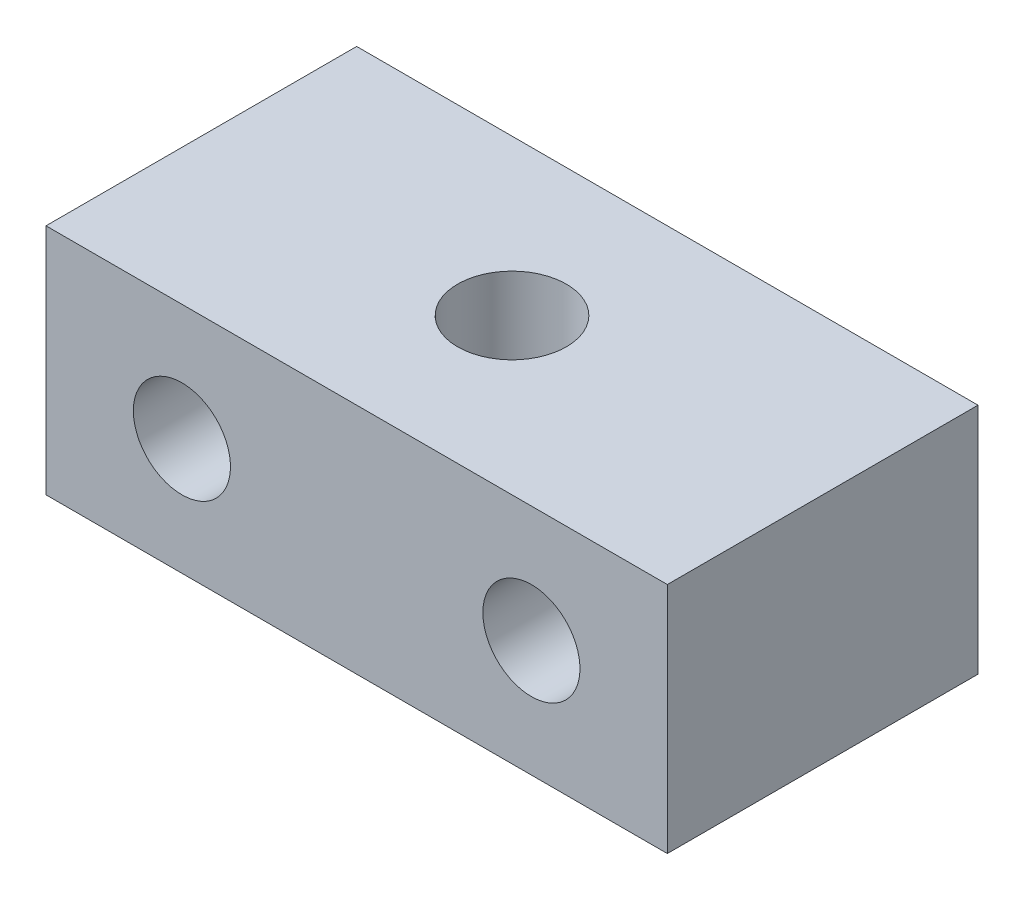
ISO-10303-21;
HEADER;
FILE_DESCRIPTION(('STEP AP214'),'2;1');
FILE_NAME('part.step','',(''),(''),'','','');
FILE_SCHEMA(('AUTOMOTIVE_DESIGN { 1 0 10303 214 1 1 1 1 }'));
ENDSEC;
DATA;
#1=APPLICATION_CONTEXT('core data for automotive mechanical design processes');
#2=APPLICATION_PROTOCOL_DEFINITION('international standard','automotive_design',2000,#1);
#3=PRODUCT_CONTEXT('',#1,'mechanical');
#4=PRODUCT('Part','Part','',(#3));
#5=PRODUCT_RELATED_PRODUCT_CATEGORY('part','',(#4));
#6=PRODUCT_DEFINITION_FORMATION('','',#4);
#7=PRODUCT_DEFINITION_CONTEXT('part definition',#1,'design');
#8=PRODUCT_DEFINITION('design','',#6,#7);
#9=PRODUCT_DEFINITION_SHAPE('','',#8);
#10=(LENGTH_UNIT() NAMED_UNIT(*) SI_UNIT(.MILLI.,.METRE.));
#11=(NAMED_UNIT(*) PLANE_ANGLE_UNIT() SI_UNIT($,.RADIAN.));
#12=(NAMED_UNIT(*) SI_UNIT($,.STERADIAN.) SOLID_ANGLE_UNIT());
#13=UNCERTAINTY_MEASURE_WITH_UNIT(LENGTH_MEASURE(1.E-05),#10,'distance_accuracy_value','');
#14=(GEOMETRIC_REPRESENTATION_CONTEXT(3) GLOBAL_UNCERTAINTY_ASSIGNED_CONTEXT((#13)) GLOBAL_UNIT_ASSIGNED_CONTEXT((#10,
#11,#12)) REPRESENTATION_CONTEXT('',''));
#15=CARTESIAN_POINT('',(0.,0.,0.));
#16=DIRECTION('',(0.,0.,1.));
#17=DIRECTION('',(1.,0.,0.));
#18=AXIS2_PLACEMENT_3D('',#15,#16,#17);
#19=CARTESIAN_POINT('',(0.,0.,12.7));
#20=DIRECTION('',(0.,0.,1.));
#21=DIRECTION('',(1.,0.,0.));
#22=AXIS2_PLACEMENT_3D('',#19,#20,#21);
#23=PLANE('',#22);
#24=CARTESIAN_POINT('',(-14.2875,0.,12.7));
#25=DIRECTION('',(0.,0.,1.));
#26=DIRECTION('',(1.,0.,0.));
#27=AXIS2_PLACEMENT_3D('',#24,#25,#26);
#28=CIRCLE('',#27,3.96875);
#29=CARTESIAN_POINT('',(-18.25625,0.,12.7));
#30=VERTEX_POINT('',#29);
#31=EDGE_CURVE('E116',#30,#30,#28,.T.);
#32=ORIENTED_EDGE('',*,*,#31,.F.);
#33=EDGE_LOOP('',(#32));
#34=FACE_BOUND('',#33,.T.);
#35=DIRECTION('',(0.,1.,0.));
#36=VECTOR('',#35,1.);
#37=CARTESIAN_POINT('',(25.4,9.525,12.7));
#38=LINE('',#37,#36);
#39=CARTESIAN_POINT('',(25.4,-9.525,12.7));
#40=VERTEX_POINT('',#39);
#41=CARTESIAN_POINT('',(25.4,9.525,12.7));
#42=VERTEX_POINT('',#41);
#43=EDGE_CURVE('E96',#40,#42,#38,.T.);
#44=ORIENTED_EDGE('',*,*,#43,.T.);
#45=DIRECTION('',(-1.,0.,0.));
#46=VECTOR('',#45,1.);
#47=CARTESIAN_POINT('',(-25.4,9.525,12.7));
#48=LINE('',#47,#46);
#49=CARTESIAN_POINT('',(-25.4,9.525,12.7));
#50=VERTEX_POINT('',#49);
#51=EDGE_CURVE('E91',#42,#50,#48,.T.);
#52=ORIENTED_EDGE('',*,*,#51,.T.);
#53=DIRECTION('',(0.,-1.,0.));
#54=VECTOR('',#53,1.);
#55=CARTESIAN_POINT('',(-25.4,9.525,12.7));
#56=LINE('',#55,#54);
#57=CARTESIAN_POINT('',(-25.4,-9.525,12.7));
#58=VERTEX_POINT('',#57);
#59=EDGE_CURVE('E94',#50,#58,#56,.T.);
#60=ORIENTED_EDGE('',*,*,#59,.T.);
#61=DIRECTION('',(1.,0.,0.));
#62=VECTOR('',#61,1.);
#63=CARTESIAN_POINT('',(-25.4,-9.525,12.7));
#64=LINE('',#63,#62);
#65=EDGE_CURVE('E61',#58,#40,#64,.T.);
#66=ORIENTED_EDGE('',*,*,#65,.T.);
#67=EDGE_LOOP('',(#44,#52,#60,#66));
#68=FACE_BOUND('',#67,.T.);
#69=CARTESIAN_POINT('',(14.2875,0.,12.7));
#70=DIRECTION('',(0.,0.,1.));
#71=DIRECTION('',(1.,0.,0.));
#72=AXIS2_PLACEMENT_3D('',#69,#70,#71);
#73=CIRCLE('',#72,3.96875);
#74=CARTESIAN_POINT('',(10.31875,0.,12.7));
#75=VERTEX_POINT('',#74);
#76=EDGE_CURVE('E138',#75,#75,#73,.T.);
#77=ORIENTED_EDGE('',*,*,#76,.F.);
#78=EDGE_LOOP('',(#77));
#79=FACE_BOUND('',#78,.T.);
#80=ADVANCED_FACE('F43',(#34,#68,#79),#23,.T.);
#81=CARTESIAN_POINT('',(0.,0.,-12.7));
#82=DIRECTION('',(0.,0.,1.));
#83=DIRECTION('',(1.,0.,0.));
#84=AXIS2_PLACEMENT_3D('',#81,#82,#83);
#85=PLANE('',#84);
#86=DIRECTION('',(0.,1.,0.));
#87=VECTOR('',#86,1.);
#88=CARTESIAN_POINT('',(25.4,9.525,-12.7));
#89=LINE('',#88,#87);
#90=CARTESIAN_POINT('',(25.4,-9.525,-12.7));
#91=VERTEX_POINT('',#90);
#92=CARTESIAN_POINT('',(25.4,9.525,-12.7));
#93=VERTEX_POINT('',#92);
#94=EDGE_CURVE('E112',#91,#93,#89,.T.);
#95=ORIENTED_EDGE('',*,*,#94,.F.);
#96=DIRECTION('',(1.,0.,0.));
#97=VECTOR('',#96,1.);
#98=CARTESIAN_POINT('',(-25.4,-9.525,-12.7));
#99=LINE('',#98,#97);
#100=CARTESIAN_POINT('',(-25.4,-9.525,-12.7));
#101=VERTEX_POINT('',#100);
#102=EDGE_CURVE('E84',#101,#91,#99,.T.);
#103=ORIENTED_EDGE('',*,*,#102,.F.);
#104=DIRECTION('',(0.,-1.,0.));
#105=VECTOR('',#104,1.);
#106=CARTESIAN_POINT('',(-25.4,9.525,-12.7));
#107=LINE('',#106,#105);
#108=CARTESIAN_POINT('',(-25.4,9.525,-12.7));
#109=VERTEX_POINT('',#108);
#110=EDGE_CURVE('E78',#109,#101,#107,.T.);
#111=ORIENTED_EDGE('',*,*,#110,.F.);
#112=DIRECTION('',(-1.,0.,0.));
#113=VECTOR('',#112,1.);
#114=CARTESIAN_POINT('',(-25.4,9.525,-12.7));
#115=LINE('',#114,#113);
#116=EDGE_CURVE('E101',#93,#109,#115,.T.);
#117=ORIENTED_EDGE('',*,*,#116,.F.);
#118=EDGE_LOOP('',(#95,#103,#111,#117));
#119=FACE_BOUND('',#118,.T.);
#120=CARTESIAN_POINT('',(-14.2875,0.,-12.7));
#121=DIRECTION('',(0.,0.,1.));
#122=DIRECTION('',(1.,0.,0.));
#123=AXIS2_PLACEMENT_3D('',#120,#121,#122);
#124=CIRCLE('',#123,3.96875);
#125=CARTESIAN_POINT('',(-18.25625,0.,-12.7));
#126=VERTEX_POINT('',#125);
#127=EDGE_CURVE('E134',#126,#126,#124,.T.);
#128=ORIENTED_EDGE('',*,*,#127,.T.);
#129=EDGE_LOOP('',(#128));
#130=FACE_BOUND('',#129,.T.);
#131=CARTESIAN_POINT('',(14.2875,0.,-12.7));
#132=DIRECTION('',(0.,0.,1.));
#133=DIRECTION('',(1.,0.,0.));
#134=AXIS2_PLACEMENT_3D('',#131,#132,#133);
#135=CIRCLE('',#134,3.96875);
#136=CARTESIAN_POINT('',(10.31875,0.,-12.7));
#137=VERTEX_POINT('',#136);
#138=EDGE_CURVE('E142',#137,#137,#135,.T.);
#139=ORIENTED_EDGE('',*,*,#138,.T.);
#140=EDGE_LOOP('',(#139));
#141=FACE_BOUND('',#140,.T.);
#142=ADVANCED_FACE('F129',(#119,#130,#141),#85,.F.);
#143=CARTESIAN_POINT('',(25.4,9.525,12.7));
#144=DIRECTION('',(-1.,0.,0.));
#145=DIRECTION('',(0.,0.,1.));
#146=AXIS2_PLACEMENT_3D('',#143,#144,#145);
#147=PLANE('',#146);
#148=ORIENTED_EDGE('',*,*,#94,.T.);
#149=DIRECTION('',(0.,0.,-1.));
#150=VECTOR('',#149,1.);
#151=CARTESIAN_POINT('',(25.4,9.525,12.7));
#152=LINE('',#151,#150);
#153=EDGE_CURVE('E11',#42,#93,#152,.T.);
#154=ORIENTED_EDGE('',*,*,#153,.F.);
#155=ORIENTED_EDGE('',*,*,#43,.F.);
#156=DIRECTION('',(0.,0.,-1.));
#157=VECTOR('',#156,1.);
#158=CARTESIAN_POINT('',(25.4,-9.525,12.7));
#159=LINE('',#158,#157);
#160=EDGE_CURVE('E108',#40,#91,#159,.T.);
#161=ORIENTED_EDGE('',*,*,#160,.T.);
#162=EDGE_LOOP('',(#148,#154,#155,#161));
#163=FACE_BOUND('',#162,.T.);
#164=ADVANCED_FACE('F45',(#163),#147,.F.);
#165=CARTESIAN_POINT('',(-25.4,9.525,12.7));
#166=DIRECTION('',(0.,-1.,0.));
#167=DIRECTION('',(0.,0.,-1.));
#168=AXIS2_PLACEMENT_3D('',#165,#166,#167);
#169=PLANE('',#168);
#170=CARTESIAN_POINT('',(0.,9.525,0.));
#171=DIRECTION('',(0.,1.,0.));
#172=DIRECTION('',(0.,0.,1.));
#173=AXIS2_PLACEMENT_3D('',#170,#171,#172);
#174=CIRCLE('',#173,4.445);
#175=CARTESIAN_POINT('',(0.,9.525,4.445));
#176=VERTEX_POINT('',#175);
#177=EDGE_CURVE('E150',#176,#176,#174,.T.);
#178=ORIENTED_EDGE('',*,*,#177,.F.);
#179=EDGE_LOOP('',(#178));
#180=FACE_BOUND('',#179,.T.);
#181=ORIENTED_EDGE('',*,*,#116,.T.);
#182=DIRECTION('',(0.,0.,-1.));
#183=VECTOR('',#182,1.);
#184=CARTESIAN_POINT('',(-25.4,9.525,12.7));
#185=LINE('',#184,#183);
#186=EDGE_CURVE('E53',#50,#109,#185,.T.);
#187=ORIENTED_EDGE('',*,*,#186,.F.);
#188=ORIENTED_EDGE('',*,*,#51,.F.);
#189=ORIENTED_EDGE('',*,*,#153,.T.);
#190=EDGE_LOOP('',(#181,#187,#188,#189));
#191=FACE_BOUND('',#190,.T.);
#192=ADVANCED_FACE('F100',(#180,#191),#169,.F.);
#193=CARTESIAN_POINT('',(-25.4,9.525,12.7));
#194=DIRECTION('',(1.,0.,0.));
#195=DIRECTION('',(0.,1.,0.));
#196=AXIS2_PLACEMENT_3D('',#193,#194,#195);
#197=PLANE('',#196);
#198=ORIENTED_EDGE('',*,*,#110,.T.);
#199=DIRECTION('',(0.,0.,-1.));
#200=VECTOR('',#199,1.);
#201=CARTESIAN_POINT('',(-25.4,-9.525,12.7));
#202=LINE('',#201,#200);
#203=EDGE_CURVE('E103',#58,#101,#202,.T.);
#204=ORIENTED_EDGE('',*,*,#203,.F.);
#205=ORIENTED_EDGE('',*,*,#59,.F.);
#206=ORIENTED_EDGE('',*,*,#186,.T.);
#207=EDGE_LOOP('',(#198,#204,#205,#206));
#208=FACE_BOUND('',#207,.T.);
#209=ADVANCED_FACE('F104',(#208),#197,.F.);
#210=CARTESIAN_POINT('',(-25.4,-9.525,12.7));
#211=DIRECTION('',(0.,1.,0.));
#212=DIRECTION('',(0.,0.,1.));
#213=AXIS2_PLACEMENT_3D('',#210,#211,#212);
#214=PLANE('',#213);
#215=CARTESIAN_POINT('',(0.,-9.525,0.));
#216=DIRECTION('',(0.,1.,0.));
#217=DIRECTION('',(0.,0.,1.));
#218=AXIS2_PLACEMENT_3D('',#215,#216,#217);
#219=CIRCLE('',#218,4.445);
#220=CARTESIAN_POINT('',(0.,-9.525,4.445));
#221=VERTEX_POINT('',#220);
#222=EDGE_CURVE('E146',#221,#221,#219,.T.);
#223=ORIENTED_EDGE('',*,*,#222,.T.);
#224=EDGE_LOOP('',(#223));
#225=FACE_BOUND('',#224,.T.);
#226=ORIENTED_EDGE('',*,*,#102,.T.);
#227=ORIENTED_EDGE('',*,*,#160,.F.);
#228=ORIENTED_EDGE('',*,*,#65,.F.);
#229=ORIENTED_EDGE('',*,*,#203,.T.);
#230=EDGE_LOOP('',(#226,#227,#228,#229));
#231=FACE_BOUND('',#230,.T.);
#232=ADVANCED_FACE('F126',(#225,#231),#214,.F.);
#233=CARTESIAN_POINT('',(-14.2875,0.,12.7));
#234=DIRECTION('',(0.,0.,-1.));
#235=DIRECTION('',(-1.,0.,0.));
#236=AXIS2_PLACEMENT_3D('',#233,#234,#235);
#237=CYLINDRICAL_SURFACE('',#236,3.96875);
#238=CARTESIAN_POINT('',(-18.25625,0.,12.7));
#239=CARTESIAN_POINT('',(-18.25625,0.,12.4354166666667));
#240=CARTESIAN_POINT('',(-18.25625,0.,12.1708333333333));
#241=CARTESIAN_POINT('',(-18.25625,0.,11.6416666666667));
#242=CARTESIAN_POINT('',(-18.25625,0.,11.3770833333333));
#243=CARTESIAN_POINT('',(-18.25625,0.,10.8479166666667));
#244=CARTESIAN_POINT('',(-18.25625,0.,10.5833333333333));
#245=CARTESIAN_POINT('',(-18.25625,0.,10.0541666666667));
#246=CARTESIAN_POINT('',(-18.25625,0.,9.78958333333333));
#247=CARTESIAN_POINT('',(-18.25625,0.,9.26041666666667));
#248=CARTESIAN_POINT('',(-18.25625,0.,8.99583333333333));
#249=CARTESIAN_POINT('',(-18.25625,0.,8.46666666666667));
#250=CARTESIAN_POINT('',(-18.25625,0.,8.20208333333333));
#251=CARTESIAN_POINT('',(-18.25625,0.,7.67291666666667));
#252=CARTESIAN_POINT('',(-18.25625,0.,7.40833333333333));
#253=CARTESIAN_POINT('',(-18.25625,0.,6.87916666666667));
#254=CARTESIAN_POINT('',(-18.25625,0.,6.61458333333333));
#255=CARTESIAN_POINT('',(-18.25625,0.,6.08541666666667));
#256=CARTESIAN_POINT('',(-18.25625,0.,5.82083333333333));
#257=CARTESIAN_POINT('',(-18.25625,0.,5.29166666666667));
#258=CARTESIAN_POINT('',(-18.25625,0.,5.02708333333333));
#259=CARTESIAN_POINT('',(-18.25625,0.,4.49791666666667));
#260=CARTESIAN_POINT('',(-18.25625,0.,4.23333333333333));
#261=CARTESIAN_POINT('',(-18.25625,0.,3.70416666666667));
#262=CARTESIAN_POINT('',(-18.25625,0.,3.43958333333333));
#263=CARTESIAN_POINT('',(-18.25625,0.,2.91041666666667));
#264=CARTESIAN_POINT('',(-18.25625,0.,2.64583333333333));
#265=CARTESIAN_POINT('',(-18.25625,0.,2.11666666666667));
#266=CARTESIAN_POINT('',(-18.25625,0.,1.85208333333333));
#267=CARTESIAN_POINT('',(-18.25625,0.,1.32291666666666));
#268=CARTESIAN_POINT('',(-18.25625,0.,1.05833333333333));
#269=CARTESIAN_POINT('',(-18.25625,0.,0.529166666666664));
#270=CARTESIAN_POINT('',(-18.25625,0.,0.264583333333331));
#271=CARTESIAN_POINT('',(-18.25625,0.,-0.264583333333335));
#272=CARTESIAN_POINT('',(-18.25625,0.,-0.529166666666668));
#273=CARTESIAN_POINT('',(-18.25625,0.,-1.05833333333333));
#274=CARTESIAN_POINT('',(-18.25625,0.,-1.32291666666667));
#275=CARTESIAN_POINT('',(-18.25625,0.,-1.85208333333334));
#276=CARTESIAN_POINT('',(-18.25625,0.,-2.11666666666667));
#277=CARTESIAN_POINT('',(-18.25625,0.,-2.64583333333334));
#278=CARTESIAN_POINT('',(-18.25625,0.,-2.91041666666667));
#279=CARTESIAN_POINT('',(-18.25625,0.,-3.43958333333333));
#280=CARTESIAN_POINT('',(-18.25625,0.,-3.70416666666667));
#281=CARTESIAN_POINT('',(-18.25625,0.,-4.23333333333333));
#282=CARTESIAN_POINT('',(-18.25625,0.,-4.49791666666667));
#283=CARTESIAN_POINT('',(-18.25625,0.,-5.02708333333333));
#284=CARTESIAN_POINT('',(-18.25625,0.,-5.29166666666667));
#285=CARTESIAN_POINT('',(-18.25625,0.,-5.82083333333333));
#286=CARTESIAN_POINT('',(-18.25625,0.,-6.08541666666667));
#287=CARTESIAN_POINT('',(-18.25625,0.,-6.61458333333333));
#288=CARTESIAN_POINT('',(-18.25625,0.,-6.87916666666667));
#289=CARTESIAN_POINT('',(-18.25625,0.,-7.40833333333333));
#290=CARTESIAN_POINT('',(-18.25625,0.,-7.67291666666667));
#291=CARTESIAN_POINT('',(-18.25625,0.,-8.20208333333333));
#292=CARTESIAN_POINT('',(-18.25625,0.,-8.46666666666667));
#293=CARTESIAN_POINT('',(-18.25625,0.,-8.99583333333334));
#294=CARTESIAN_POINT('',(-18.25625,0.,-9.26041666666667));
#295=CARTESIAN_POINT('',(-18.25625,0.,-9.78958333333333));
#296=CARTESIAN_POINT('',(-18.25625,0.,-10.0541666666667));
#297=CARTESIAN_POINT('',(-18.25625,0.,-10.5833333333333));
#298=CARTESIAN_POINT('',(-18.25625,0.,-10.8479166666667));
#299=CARTESIAN_POINT('',(-18.25625,0.,-11.3770833333333));
#300=CARTESIAN_POINT('',(-18.25625,0.,-11.6416666666667));
#301=CARTESIAN_POINT('',(-18.25625,0.,-12.1708333333333));
#302=CARTESIAN_POINT('',(-18.25625,0.,-12.4354166666667));
#303=CARTESIAN_POINT('',(-18.25625,0.,-12.7));
#304=B_SPLINE_CURVE_WITH_KNOTS('',3,(#238,#239,#240,#241,#242,#243,#244,#245,#246,#247,#248,
#249,#250,#251,#252,#253,#254,#255,#256,#257,#258,#259,#260,#261,#262,#263,#264,#265,#266,#267,
#268,#269,#270,#271,#272,#273,#274,#275,#276,#277,#278,#279,#280,#281,#282,#283,#284,#285,#286,
#287,#288,#289,#290,#291,#292,#293,#294,#295,#296,#297,#298,#299,#300,#301,#302,#303),
.UNSPECIFIED.,.F.,.F.,(4,2,2,2,2,2,2,2,2,2,2,2,2,2,2,2,2,2,2,2,2,2,2,2,2,2,2,2,2,2,2,2,4),(0.,
0.793749999999999,1.5875,2.38125,3.175,3.96875,4.7625,5.55625,6.35,7.14375,7.9375,8.73125,9.525,
10.31875,11.1125,11.90625,12.7,13.49375,14.2875,15.08125,15.875,16.66875,17.4625,18.25625,19.05,
19.84375,20.6375,21.43125,22.225,23.01875,23.8125,24.60625,25.4),.UNSPECIFIED.);
#305=EDGE_CURVE('BSEAM181',#30,#126,#304,.T.);
#306=ORIENTED_EDGE('',*,*,#31,.T.);
#307=ORIENTED_EDGE('',*,*,#127,.F.);
#308=ORIENTED_EDGE('',*,*,#305,.T.);
#309=ORIENTED_EDGE('',*,*,#305,.F.);
#310=EDGE_LOOP('',(#306,#308,#307,#309));
#311=FACE_BOUND('',#310,.T.);
#312=ADVANCED_FACE('F181',(#311),#237,.F.);
#313=CARTESIAN_POINT('',(14.2875,0.,12.7));
#314=DIRECTION('',(0.,0.,-1.));
#315=DIRECTION('',(-1.,0.,0.));
#316=AXIS2_PLACEMENT_3D('',#313,#314,#315);
#317=CYLINDRICAL_SURFACE('',#316,3.96875);
#318=CARTESIAN_POINT('',(10.31875,0.,12.7));
#319=CARTESIAN_POINT('',(10.31875,0.,12.4354166666667));
#320=CARTESIAN_POINT('',(10.31875,0.,12.1708333333333));
#321=CARTESIAN_POINT('',(10.31875,0.,11.6416666666667));
#322=CARTESIAN_POINT('',(10.31875,0.,11.3770833333333));
#323=CARTESIAN_POINT('',(10.31875,0.,10.8479166666667));
#324=CARTESIAN_POINT('',(10.31875,0.,10.5833333333333));
#325=CARTESIAN_POINT('',(10.31875,0.,10.0541666666667));
#326=CARTESIAN_POINT('',(10.31875,0.,9.78958333333333));
#327=CARTESIAN_POINT('',(10.31875,0.,9.26041666666667));
#328=CARTESIAN_POINT('',(10.31875,0.,8.99583333333333));
#329=CARTESIAN_POINT('',(10.31875,0.,8.46666666666667));
#330=CARTESIAN_POINT('',(10.31875,0.,8.20208333333333));
#331=CARTESIAN_POINT('',(10.31875,0.,7.67291666666667));
#332=CARTESIAN_POINT('',(10.31875,0.,7.40833333333333));
#333=CARTESIAN_POINT('',(10.31875,0.,6.87916666666667));
#334=CARTESIAN_POINT('',(10.31875,0.,6.61458333333333));
#335=CARTESIAN_POINT('',(10.31875,0.,6.08541666666667));
#336=CARTESIAN_POINT('',(10.31875,0.,5.82083333333333));
#337=CARTESIAN_POINT('',(10.31875,0.,5.29166666666667));
#338=CARTESIAN_POINT('',(10.31875,0.,5.02708333333333));
#339=CARTESIAN_POINT('',(10.31875,0.,4.49791666666667));
#340=CARTESIAN_POINT('',(10.31875,0.,4.23333333333333));
#341=CARTESIAN_POINT('',(10.31875,0.,3.70416666666667));
#342=CARTESIAN_POINT('',(10.31875,0.,3.43958333333333));
#343=CARTESIAN_POINT('',(10.31875,0.,2.91041666666667));
#344=CARTESIAN_POINT('',(10.31875,0.,2.64583333333333));
#345=CARTESIAN_POINT('',(10.31875,0.,2.11666666666667));
#346=CARTESIAN_POINT('',(10.31875,0.,1.85208333333333));
#347=CARTESIAN_POINT('',(10.31875,0.,1.32291666666666));
#348=CARTESIAN_POINT('',(10.31875,0.,1.05833333333333));
#349=CARTESIAN_POINT('',(10.31875,0.,0.529166666666664));
#350=CARTESIAN_POINT('',(10.31875,0.,0.264583333333331));
#351=CARTESIAN_POINT('',(10.31875,0.,-0.264583333333335));
#352=CARTESIAN_POINT('',(10.31875,0.,-0.529166666666668));
#353=CARTESIAN_POINT('',(10.31875,0.,-1.05833333333333));
#354=CARTESIAN_POINT('',(10.31875,0.,-1.32291666666667));
#355=CARTESIAN_POINT('',(10.31875,0.,-1.85208333333334));
#356=CARTESIAN_POINT('',(10.31875,0.,-2.11666666666667));
#357=CARTESIAN_POINT('',(10.31875,0.,-2.64583333333334));
#358=CARTESIAN_POINT('',(10.31875,0.,-2.91041666666667));
#359=CARTESIAN_POINT('',(10.31875,0.,-3.43958333333333));
#360=CARTESIAN_POINT('',(10.31875,0.,-3.70416666666667));
#361=CARTESIAN_POINT('',(10.31875,0.,-4.23333333333333));
#362=CARTESIAN_POINT('',(10.31875,0.,-4.49791666666667));
#363=CARTESIAN_POINT('',(10.31875,0.,-5.02708333333333));
#364=CARTESIAN_POINT('',(10.31875,0.,-5.29166666666667));
#365=CARTESIAN_POINT('',(10.31875,0.,-5.82083333333333));
#366=CARTESIAN_POINT('',(10.31875,0.,-6.08541666666667));
#367=CARTESIAN_POINT('',(10.31875,0.,-6.61458333333333));
#368=CARTESIAN_POINT('',(10.31875,0.,-6.87916666666667));
#369=CARTESIAN_POINT('',(10.31875,0.,-7.40833333333333));
#370=CARTESIAN_POINT('',(10.31875,0.,-7.67291666666667));
#371=CARTESIAN_POINT('',(10.31875,0.,-8.20208333333333));
#372=CARTESIAN_POINT('',(10.31875,0.,-8.46666666666667));
#373=CARTESIAN_POINT('',(10.31875,0.,-8.99583333333334));
#374=CARTESIAN_POINT('',(10.31875,0.,-9.26041666666667));
#375=CARTESIAN_POINT('',(10.31875,0.,-9.78958333333333));
#376=CARTESIAN_POINT('',(10.31875,0.,-10.0541666666667));
#377=CARTESIAN_POINT('',(10.31875,0.,-10.5833333333333));
#378=CARTESIAN_POINT('',(10.31875,0.,-10.8479166666667));
#379=CARTESIAN_POINT('',(10.31875,0.,-11.3770833333333));
#380=CARTESIAN_POINT('',(10.31875,0.,-11.6416666666667));
#381=CARTESIAN_POINT('',(10.31875,0.,-12.1708333333333));
#382=CARTESIAN_POINT('',(10.31875,0.,-12.4354166666667));
#383=CARTESIAN_POINT('',(10.31875,0.,-12.7));
#384=B_SPLINE_CURVE_WITH_KNOTS('',3,(#318,#319,#320,#321,#322,#323,#324,#325,#326,#327,#328,
#329,#330,#331,#332,#333,#334,#335,#336,#337,#338,#339,#340,#341,#342,#343,#344,#345,#346,#347,
#348,#349,#350,#351,#352,#353,#354,#355,#356,#357,#358,#359,#360,#361,#362,#363,#364,#365,#366,
#367,#368,#369,#370,#371,#372,#373,#374,#375,#376,#377,#378,#379,#380,#381,#382,#383),
.UNSPECIFIED.,.F.,.F.,(4,2,2,2,2,2,2,2,2,2,2,2,2,2,2,2,2,2,2,2,2,2,2,2,2,2,2,2,2,2,2,2,4),(0.,
0.793749999999999,1.5875,2.38125,3.175,3.96875,4.7625,5.55625,6.35,7.14375,7.9375,8.73125,9.525,
10.31875,11.1125,11.90625,12.7,13.49375,14.2875,15.08125,15.875,16.66875,17.4625,18.25625,19.05,
19.84375,20.6375,21.43125,22.225,23.01875,23.8125,24.60625,25.4),.UNSPECIFIED.);
#385=EDGE_CURVE('BSEAM162',#75,#137,#384,.T.);
#386=ORIENTED_EDGE('',*,*,#76,.T.);
#387=ORIENTED_EDGE('',*,*,#138,.F.);
#388=ORIENTED_EDGE('',*,*,#385,.T.);
#389=ORIENTED_EDGE('',*,*,#385,.F.);
#390=EDGE_LOOP('',(#386,#388,#387,#389));
#391=FACE_BOUND('',#390,.T.);
#392=ADVANCED_FACE('F162',(#391),#317,.F.);
#393=CARTESIAN_POINT('',(0.,-9.525,0.));
#394=DIRECTION('',(0.,1.,0.));
#395=DIRECTION('',(0.,0.,1.));
#396=AXIS2_PLACEMENT_3D('',#393,#394,#395);
#397=CYLINDRICAL_SURFACE('',#396,4.445);
#398=CARTESIAN_POINT('',(0.,-9.525,4.445));
#399=CARTESIAN_POINT('',(0.,-9.3265625,4.445));
#400=CARTESIAN_POINT('',(0.,-9.128125,4.445));
#401=CARTESIAN_POINT('',(0.,-8.73125,4.445));
#402=CARTESIAN_POINT('',(0.,-8.5328125,4.445));
#403=CARTESIAN_POINT('',(0.,-8.1359375,4.445));
#404=CARTESIAN_POINT('',(0.,-7.9375,4.445));
#405=CARTESIAN_POINT('',(0.,-7.540625,4.445));
#406=CARTESIAN_POINT('',(0.,-7.3421875,4.445));
#407=CARTESIAN_POINT('',(0.,-6.9453125,4.445));
#408=CARTESIAN_POINT('',(0.,-6.746875,4.445));
#409=CARTESIAN_POINT('',(0.,-6.35,4.445));
#410=CARTESIAN_POINT('',(0.,-6.1515625,4.445));
#411=CARTESIAN_POINT('',(0.,-5.7546875,4.445));
#412=CARTESIAN_POINT('',(0.,-5.55625,4.445));
#413=CARTESIAN_POINT('',(0.,-5.159375,4.445));
#414=CARTESIAN_POINT('',(0.,-4.9609375,4.445));
#415=CARTESIAN_POINT('',(0.,-4.5640625,4.445));
#416=CARTESIAN_POINT('',(0.,-4.365625,4.445));
#417=CARTESIAN_POINT('',(0.,-3.96875,4.445));
#418=CARTESIAN_POINT('',(0.,-3.7703125,4.445));
#419=CARTESIAN_POINT('',(0.,-3.3734375,4.445));
#420=CARTESIAN_POINT('',(0.,-3.175,4.445));
#421=CARTESIAN_POINT('',(0.,-2.778125,4.445));
#422=CARTESIAN_POINT('',(0.,-2.5796875,4.445));
#423=CARTESIAN_POINT('',(0.,-2.1828125,4.445));
#424=CARTESIAN_POINT('',(0.,-1.984375,4.445));
#425=CARTESIAN_POINT('',(0.,-1.5875,4.445));
#426=CARTESIAN_POINT('',(0.,-1.3890625,4.445));
#427=CARTESIAN_POINT('',(0.,-0.992187500000001,4.445));
#428=CARTESIAN_POINT('',(0.,-0.793750000000001,4.445));
#429=CARTESIAN_POINT('',(0.,-0.396875,4.445));
#430=CARTESIAN_POINT('',(0.,-0.1984375,4.445));
#431=CARTESIAN_POINT('',(0.,0.1984375,4.445));
#432=CARTESIAN_POINT('',(0.,0.396875,4.445));
#433=CARTESIAN_POINT('',(0.,0.793750000000001,4.445));
#434=CARTESIAN_POINT('',(0.,0.992187500000001,4.445));
#435=CARTESIAN_POINT('',(0.,1.3890625,4.445));
#436=CARTESIAN_POINT('',(0.,1.5875,4.445));
#437=CARTESIAN_POINT('',(0.,1.984375,4.445));
#438=CARTESIAN_POINT('',(0.,2.1828125,4.445));
#439=CARTESIAN_POINT('',(0.,2.5796875,4.445));
#440=CARTESIAN_POINT('',(0.,2.778125,4.445));
#441=CARTESIAN_POINT('',(0.,3.175,4.445));
#442=CARTESIAN_POINT('',(0.,3.3734375,4.445));
#443=CARTESIAN_POINT('',(0.,3.7703125,4.445));
#444=CARTESIAN_POINT('',(0.,3.96875,4.445));
#445=CARTESIAN_POINT('',(0.,4.365625,4.445));
#446=CARTESIAN_POINT('',(0.,4.5640625,4.445));
#447=CARTESIAN_POINT('',(0.,4.9609375,4.445));
#448=CARTESIAN_POINT('',(0.,5.159375,4.445));
#449=CARTESIAN_POINT('',(0.,5.55625,4.445));
#450=CARTESIAN_POINT('',(0.,5.7546875,4.445));
#451=CARTESIAN_POINT('',(0.,6.1515625,4.445));
#452=CARTESIAN_POINT('',(0.,6.35,4.445));
#453=CARTESIAN_POINT('',(0.,6.746875,4.445));
#454=CARTESIAN_POINT('',(0.,6.9453125,4.445));
#455=CARTESIAN_POINT('',(0.,7.3421875,4.445));
#456=CARTESIAN_POINT('',(0.,7.540625,4.445));
#457=CARTESIAN_POINT('',(0.,7.9375,4.445));
#458=CARTESIAN_POINT('',(0.,8.1359375,4.445));
#459=CARTESIAN_POINT('',(0.,8.5328125,4.445));
#460=CARTESIAN_POINT('',(0.,8.73125,4.445));
#461=CARTESIAN_POINT('',(0.,9.128125,4.445));
#462=CARTESIAN_POINT('',(0.,9.3265625,4.445));
#463=CARTESIAN_POINT('',(0.,9.525,4.445));
#464=B_SPLINE_CURVE_WITH_KNOTS('',3,(#398,#399,#400,#401,#402,#403,#404,#405,#406,#407,#408,
#409,#410,#411,#412,#413,#414,#415,#416,#417,#418,#419,#420,#421,#422,#423,#424,#425,#426,#427,
#428,#429,#430,#431,#432,#433,#434,#435,#436,#437,#438,#439,#440,#441,#442,#443,#444,#445,#446,
#447,#448,#449,#450,#451,#452,#453,#454,#455,#456,#457,#458,#459,#460,#461,#462,#463),
.UNSPECIFIED.,.F.,.F.,(4,2,2,2,2,2,2,2,2,2,2,2,2,2,2,2,2,2,2,2,2,2,2,2,2,2,2,2,2,2,2,2,4),(0.,
0.5953125,1.190625,1.7859375,2.38125,2.9765625,3.571875,4.1671875,4.7625,5.3578125,5.953125,
6.5484375,7.14375,7.7390625,8.334375,8.9296875,9.525,10.1203125,10.715625,11.3109375,11.90625,
12.5015625,13.096875,13.6921875,14.2875,14.8828125,15.478125,16.0734375,16.66875,17.2640625,
17.859375,18.4546875,19.05),.UNSPECIFIED.);
#465=EDGE_CURVE('BSEAM159',#221,#176,#464,.T.);
#466=ORIENTED_EDGE('',*,*,#222,.F.);
#467=ORIENTED_EDGE('',*,*,#177,.T.);
#468=ORIENTED_EDGE('',*,*,#465,.T.);
#469=ORIENTED_EDGE('',*,*,#465,.F.);
#470=EDGE_LOOP('',(#466,#468,#467,#469));
#471=FACE_BOUND('',#470,.T.);
#472=ADVANCED_FACE('F159',(#471),#397,.F.);
#473=CLOSED_SHELL('',(#80,#142,#164,#192,#209,#232,#312,#392,#472));
#474=MANIFOLD_SOLID_BREP('B2',#473);
#475=ADVANCED_BREP_SHAPE_REPRESENTATION('',(#18,#474),#14);
#476=SHAPE_DEFINITION_REPRESENTATION(#9,#475);
ENDSEC;
END-ISO-10303-21;
